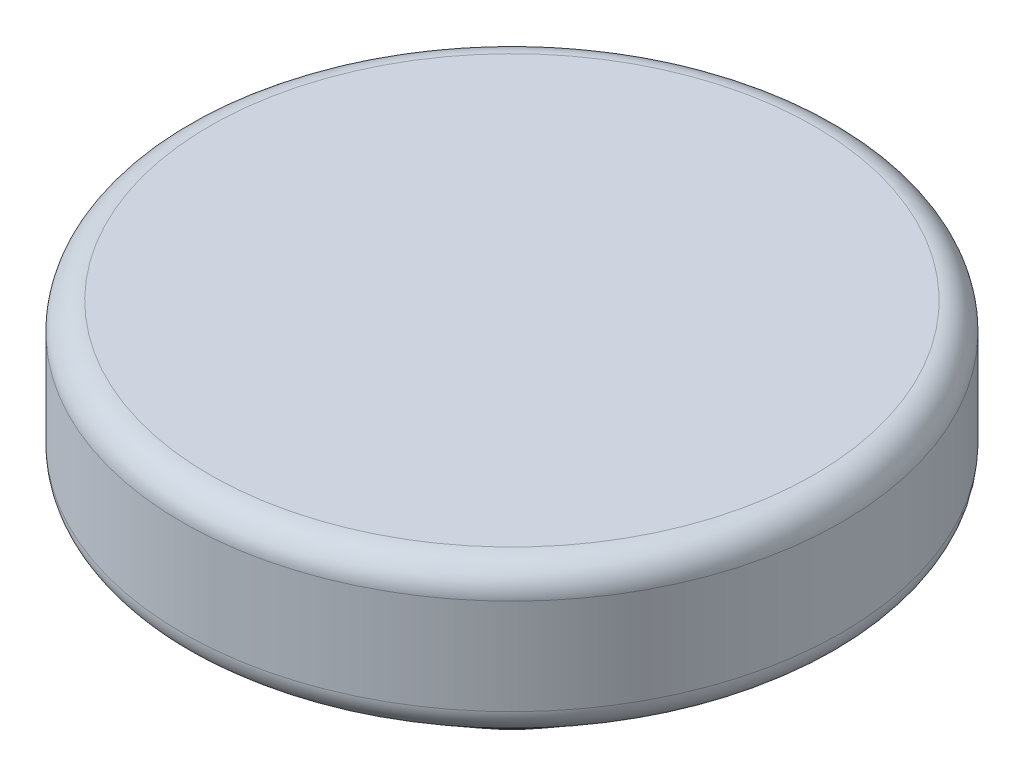
ISO-10303-21;
HEADER;
FILE_DESCRIPTION(('STEP AP214'),'2;1');
FILE_NAME('part.step','',(''),(''),'','','');
FILE_SCHEMA(('AUTOMOTIVE_DESIGN { 1 0 10303 214 1 1 1 1 }'));
ENDSEC;
DATA;
#1=APPLICATION_CONTEXT('core data for automotive mechanical design processes');
#2=APPLICATION_PROTOCOL_DEFINITION('international standard','automotive_design',2000,#1);
#3=PRODUCT_CONTEXT('',#1,'mechanical');
#4=PRODUCT('Part','Part','',(#3));
#5=PRODUCT_RELATED_PRODUCT_CATEGORY('part','',(#4));
#6=PRODUCT_DEFINITION_FORMATION('','',#4);
#7=PRODUCT_DEFINITION_CONTEXT('part definition',#1,'design');
#8=PRODUCT_DEFINITION('design','',#6,#7);
#9=PRODUCT_DEFINITION_SHAPE('','',#8);
#10=(LENGTH_UNIT() NAMED_UNIT(*) SI_UNIT(.MILLI.,.METRE.));
#11=(NAMED_UNIT(*) PLANE_ANGLE_UNIT() SI_UNIT($,.RADIAN.));
#12=(NAMED_UNIT(*) SI_UNIT($,.STERADIAN.) SOLID_ANGLE_UNIT());
#13=UNCERTAINTY_MEASURE_WITH_UNIT(LENGTH_MEASURE(1.E-05),#10,'distance_accuracy_value','');
#14=(GEOMETRIC_REPRESENTATION_CONTEXT(3) GLOBAL_UNCERTAINTY_ASSIGNED_CONTEXT((#13)) GLOBAL_UNIT_ASSIGNED_CONTEXT((#10,
#11,#12)) REPRESENTATION_CONTEXT('',''));
#15=CARTESIAN_POINT('',(0.,0.,0.));
#16=DIRECTION('',(0.,0.,1.));
#17=DIRECTION('',(1.,0.,0.));
#18=AXIS2_PLACEMENT_3D('',#15,#16,#17);
#19=CARTESIAN_POINT('',(0.,-44.9910205704343,0.));
#20=DIRECTION('',(0.,1.,0.));
#21=DIRECTION('',(-1.,0.,0.));
#22=AXIS2_PLACEMENT_3D('',#19,#20,#21);
#23=PLANE('',#22);
#24=CARTESIAN_POINT('',(0.,-44.9910205704343,0.));
#25=DIRECTION('',(0.,1.,0.));
#26=DIRECTION('',(-1.,0.,0.));
#27=AXIS2_PLACEMENT_3D('',#24,#25,#26);
#28=CIRCLE('',#27,23.0772096795489);
#29=CARTESIAN_POINT('',(-23.0772096795488,-44.9910205704343,0.));
#30=VERTEX_POINT('',#29);
#31=EDGE_CURVE('E10',#30,#30,#28,.F.);
#32=ORIENTED_EDGE('',*,*,#31,.T.);
#33=EDGE_LOOP('',(#32));
#34=FACE_BOUND('',#33,.T.);
#35=ADVANCED_FACE('F34',(#34),#23,.F.);
#36=CARTESIAN_POINT('',(0.,-44.9910205704343,0.));
#37=DIRECTION('',(0.,1.,0.));
#38=DIRECTION('',(-1.,0.,0.));
#39=AXIS2_PLACEMENT_3D('',#36,#37,#38);
#40=CONICAL_SURFACE('',#39,25.,0.950546840812075);
#41=CARTESIAN_POINT('',(0.,-43.8734213976747,0.));
#42=DIRECTION('',(0.,-1.,0.));
#43=DIRECTION('',(1.,0.,0.));
#44=AXIS2_PLACEMENT_3D('',#41,#42,#43);
#45=CIRCLE('',#44,26.5646388418634);
#46=CARTESIAN_POINT('',(26.5646388418634,-43.8734213976747,0.));
#47=VERTEX_POINT('',#46);
#48=EDGE_CURVE('E41',#47,#47,#45,.F.);
#49=ORIENTED_EDGE('',*,*,#48,.T.);
#50=EDGE_LOOP('',(#49));
#51=FACE_BOUND('',#50,.T.);
#52=CARTESIAN_POINT('',(0.,-21.4865984500089,0.));
#53=DIRECTION('',(0.,-1.,0.));
#54=DIRECTION('',(1.,0.,0.));
#55=AXIS2_PLACEMENT_3D('',#52,#53,#54);
#56=CIRCLE('',#55,57.9061909685955);
#57=CARTESIAN_POINT('',(57.9061909685955,-21.4865984500089,0.));
#58=VERTEX_POINT('',#57);
#59=EDGE_CURVE('E45',#58,#58,#56,.T.);
#60=ORIENTED_EDGE('',*,*,#59,.T.);
#61=EDGE_LOOP('',(#60));
#62=FACE_BOUND('',#61,.T.);
#63=ADVANCED_FACE('F78',(#51,#62),#40,.T.);
#64=CARTESIAN_POINT('',(0.,5.00897942956573,0.));
#65=DIRECTION('',(0.,1.,0.));
#66=DIRECTION('',(-1.,0.,0.));
#67=AXIS2_PLACEMENT_3D('',#64,#65,#66);
#68=CYLINDRICAL_SURFACE('',#67,60.);
#69=CARTESIAN_POINT('',(0.,-17.4179310939753,0.));
#70=DIRECTION('',(0.,-1.,0.));
#71=DIRECTION('',(1.,0.,0.));
#72=AXIS2_PLACEMENT_3D('',#69,#70,#71);
#73=CIRCLE('',#72,60.);
#74=CARTESIAN_POINT('',(60.,-17.4179310939752,0.));
#75=VERTEX_POINT('',#74);
#76=EDGE_CURVE('E49',#75,#75,#73,.F.);
#77=ORIENTED_EDGE('',*,*,#76,.T.);
#78=EDGE_LOOP('',(#77));
#79=FACE_BOUND('',#78,.T.);
#80=CARTESIAN_POINT('',(0.,0.00897942956572598,0.));
#81=DIRECTION('',(0.,-1.,0.));
#82=DIRECTION('',(1.,0.,0.));
#83=AXIS2_PLACEMENT_3D('',#80,#81,#82);
#84=CIRCLE('',#83,60.);
#85=CARTESIAN_POINT('',(60.,0.00897942956573332,0.));
#86=VERTEX_POINT('',#85);
#87=EDGE_CURVE('E54',#86,#86,#84,.T.);
#88=ORIENTED_EDGE('',*,*,#87,.T.);
#89=EDGE_LOOP('',(#88));
#90=FACE_BOUND('',#89,.T.);
#91=ADVANCED_FACE('F73',(#79,#90),#68,.T.);
#92=CARTESIAN_POINT('',(60.,5.00897942956573,0.));
#93=DIRECTION('',(0.,-1.,0.));
#94=DIRECTION('',(1.,0.,0.));
#95=AXIS2_PLACEMENT_3D('',#92,#93,#94);
#96=PLANE('',#95);
#97=CARTESIAN_POINT('',(0.,5.00897942956573,0.));
#98=DIRECTION('',(0.,-1.,0.));
#99=DIRECTION('',(1.,0.,0.));
#100=AXIS2_PLACEMENT_3D('',#97,#98,#99);
#101=CIRCLE('',#100,55.);
#102=CARTESIAN_POINT('',(55.,5.00897942956573,0.));
#103=VERTEX_POINT('',#102);
#104=EDGE_CURVE('E57',#103,#103,#101,.F.);
#105=ORIENTED_EDGE('',*,*,#104,.T.);
#106=EDGE_LOOP('',(#105));
#107=FACE_BOUND('',#106,.T.);
#108=ADVANCED_FACE('F61',(#107),#96,.F.);
#109=CARTESIAN_POINT('',(0.,0.00897942956572598,0.));
#110=DIRECTION('',(0.,-1.,0.));
#111=DIRECTION('',(1.,0.,0.));
#112=AXIS2_PLACEMENT_3D('',#109,#110,#111);
#113=TOROIDAL_SURFACE('',#112,55.,5.);
#114=ORIENTED_EDGE('',*,*,#87,.F.);
#115=EDGE_LOOP('',(#114));
#116=FACE_BOUND('',#115,.T.);
#117=ORIENTED_EDGE('',*,*,#104,.F.);
#118=EDGE_LOOP('',(#117));
#119=FACE_BOUND('',#118,.T.);
#120=ADVANCED_FACE('F63',(#116,#119),#113,.T.);
#121=CARTESIAN_POINT('',(0.,-17.4179310939753,0.));
#122=DIRECTION('',(0.,-1.,0.));
#123=DIRECTION('',(1.,0.,0.));
#124=AXIS2_PLACEMENT_3D('',#121,#122,#123);
#125=TOROIDAL_SURFACE('',#124,55.,5.);
#126=ORIENTED_EDGE('',*,*,#59,.F.);
#127=EDGE_LOOP('',(#126));
#128=FACE_BOUND('',#127,.T.);
#129=ORIENTED_EDGE('',*,*,#76,.F.);
#130=EDGE_LOOP('',(#129));
#131=FACE_BOUND('',#130,.T.);
#132=ADVANCED_FACE('F65',(#128,#131),#125,.T.);
#133=CARTESIAN_POINT('',(0.,-38.9910205704343,0.));
#134=DIRECTION('',(0.,1.,0.));
#135=DIRECTION('',(-1.,0.,0.));
#136=AXIS2_PLACEMENT_3D('',#133,#134,#135);
#137=TOROIDAL_SURFACE('',#136,23.0772096795489,6.);
#138=ORIENTED_EDGE('',*,*,#31,.F.);
#139=EDGE_LOOP('',(#138));
#140=FACE_BOUND('',#139,.T.);
#141=ORIENTED_EDGE('',*,*,#48,.F.);
#142=EDGE_LOOP('',(#141));
#143=FACE_BOUND('',#142,.T.);
#144=ADVANCED_FACE('F36',(#140,#143),#137,.T.);
#145=CLOSED_SHELL('',(#35,#63,#91,#108,#120,#132,#144));
#146=MANIFOLD_SOLID_BREP('B2',#145);
#147=ADVANCED_BREP_SHAPE_REPRESENTATION('',(#18,#146),#14);
#148=SHAPE_DEFINITION_REPRESENTATION(#9,#147);
ENDSEC;
END-ISO-10303-21;
